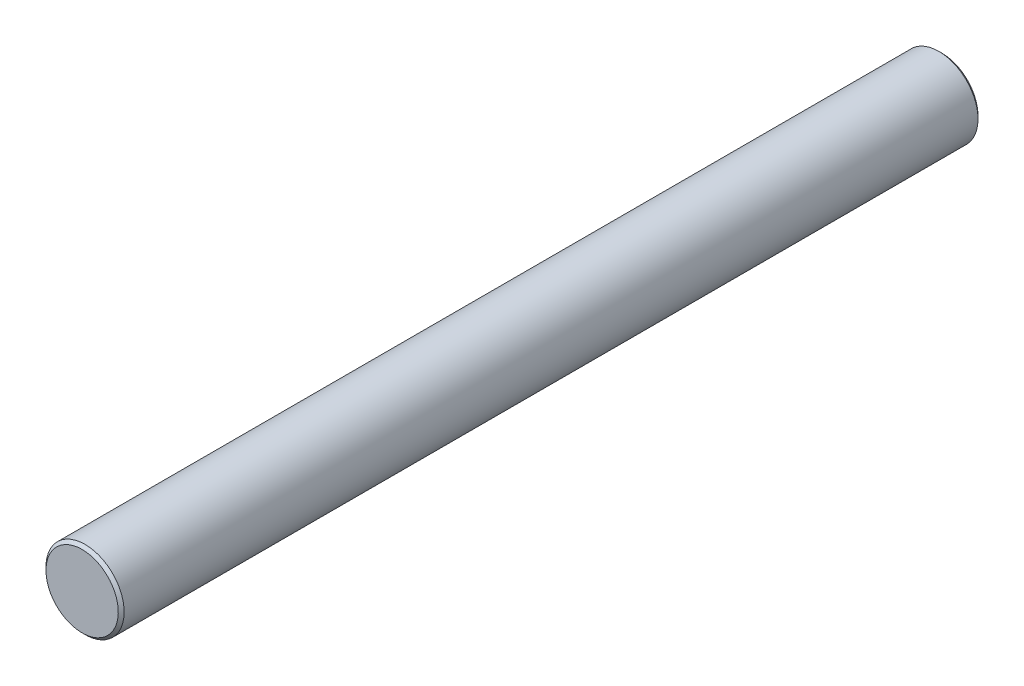
ISO-10303-21;
HEADER;
FILE_DESCRIPTION(('STEP AP214'),'2;1');
FILE_NAME('part.step','',(''),(''),'','','');
FILE_SCHEMA(('AUTOMOTIVE_DESIGN { 1 0 10303 214 1 1 1 1 }'));
ENDSEC;
DATA;
#1=APPLICATION_CONTEXT('core data for automotive mechanical design processes');
#2=APPLICATION_PROTOCOL_DEFINITION('international standard','automotive_design',2000,#1);
#3=PRODUCT_CONTEXT('',#1,'mechanical');
#4=PRODUCT('Part','Part','',(#3));
#5=PRODUCT_RELATED_PRODUCT_CATEGORY('part','',(#4));
#6=PRODUCT_DEFINITION_FORMATION('','',#4);
#7=PRODUCT_DEFINITION_CONTEXT('part definition',#1,'design');
#8=PRODUCT_DEFINITION('design','',#6,#7);
#9=PRODUCT_DEFINITION_SHAPE('','',#8);
#10=(LENGTH_UNIT() NAMED_UNIT(*) SI_UNIT(.MILLI.,.METRE.));
#11=(NAMED_UNIT(*) PLANE_ANGLE_UNIT() SI_UNIT($,.RADIAN.));
#12=(NAMED_UNIT(*) SI_UNIT($,.STERADIAN.) SOLID_ANGLE_UNIT());
#13=UNCERTAINTY_MEASURE_WITH_UNIT(LENGTH_MEASURE(1.E-05),#10,'distance_accuracy_value','');
#14=(GEOMETRIC_REPRESENTATION_CONTEXT(3) GLOBAL_UNCERTAINTY_ASSIGNED_CONTEXT((#13)) GLOBAL_UNIT_ASSIGNED_CONTEXT((#10,
#11,#12)) REPRESENTATION_CONTEXT('',''));
#15=CARTESIAN_POINT('',(0.,0.,0.));
#16=DIRECTION('',(0.,0.,1.));
#17=DIRECTION('',(1.,0.,0.));
#18=AXIS2_PLACEMENT_3D('',#15,#16,#17);
#19=CARTESIAN_POINT('',(0.,9.25,0.));
#20=DIRECTION('',(0.,0.,-1.));
#21=DIRECTION('',(0.,1.,0.));
#22=AXIS2_PLACEMENT_3D('',#19,#20,#21);
#23=PLANE('',#22);
#24=CARTESIAN_POINT('',(0.,0.,0.));
#25=DIRECTION('',(0.,0.,-1.));
#26=DIRECTION('',(0.,1.,0.));
#27=AXIS2_PLACEMENT_3D('',#24,#25,#26);
#28=CIRCLE('',#27,18.5);
#29=CARTESIAN_POINT('',(0.,18.5,0.));
#30=VERTEX_POINT('',#29);
#31=EDGE_CURVE('E9',#30,#30,#28,.T.);
#32=ORIENTED_EDGE('',*,*,#31,.T.);
#33=EDGE_LOOP('',(#32));
#34=FACE_BOUND('',#33,.T.);
#35=CARTESIAN_POINT('',(0.,0.,0.));
#36=DIRECTION('',(0.,0.,1.));
#37=DIRECTION('',(-1.,0.,0.));
#38=AXIS2_PLACEMENT_3D('',#35,#36,#37);
#39=CIRCLE('',#38,6.);
#40=CARTESIAN_POINT('',(-6.,0.,0.));
#41=VERTEX_POINT('',#40);
#42=EDGE_CURVE('E53',#41,#41,#39,.T.);
#43=ORIENTED_EDGE('',*,*,#42,.T.);
#44=EDGE_LOOP('',(#43));
#45=FACE_BOUND('',#44,.T.);
#46=ADVANCED_FACE('F15',(#34,#45),#23,.T.);
#47=CARTESIAN_POINT('',(0.,0.,0.75));
#48=DIRECTION('',(0.,0.,1.));
#49=DIRECTION('',(0.,1.,0.));
#50=AXIS2_PLACEMENT_3D('',#47,#48,#49);
#51=CONICAL_SURFACE('',#50,19.25,0.785398163397448);
#52=CARTESIAN_POINT('',(0.,0.,1.5));
#53=DIRECTION('',(0.,0.,-1.));
#54=DIRECTION('',(0.,1.,0.));
#55=AXIS2_PLACEMENT_3D('',#52,#53,#54);
#56=CIRCLE('',#55,20.);
#57=CARTESIAN_POINT('',(0.,20.,1.5));
#58=VERTEX_POINT('',#57);
#59=EDGE_CURVE('E19',#58,#58,#56,.T.);
#60=ORIENTED_EDGE('',*,*,#59,.T.);
#61=EDGE_LOOP('',(#60));
#62=FACE_BOUND('',#61,.T.);
#63=ORIENTED_EDGE('',*,*,#31,.F.);
#64=EDGE_LOOP('',(#63));
#65=FACE_BOUND('',#64,.T.);
#66=ADVANCED_FACE('F121',(#62,#65),#51,.T.);
#67=CARTESIAN_POINT('',(0.,0.,220.));
#68=DIRECTION('',(0.,0.,1.));
#69=DIRECTION('',(0.,1.,0.));
#70=AXIS2_PLACEMENT_3D('',#67,#68,#69);
#71=CYLINDRICAL_SURFACE('',#70,20.);
#72=CARTESIAN_POINT('',(0.,0.,438.5));
#73=DIRECTION('',(0.,0.,-1.));
#74=DIRECTION('',(0.,1.,0.));
#75=AXIS2_PLACEMENT_3D('',#72,#73,#74);
#76=CIRCLE('',#75,20.);
#77=CARTESIAN_POINT('',(0.,20.,438.5));
#78=VERTEX_POINT('',#77);
#79=EDGE_CURVE('E47',#78,#78,#76,.T.);
#80=ORIENTED_EDGE('',*,*,#79,.T.);
#81=EDGE_LOOP('',(#80));
#82=FACE_BOUND('',#81,.T.);
#83=ORIENTED_EDGE('',*,*,#59,.F.);
#84=EDGE_LOOP('',(#83));
#85=FACE_BOUND('',#84,.T.);
#86=CARTESIAN_POINT('',(0.,0.,6.5));
#87=DIRECTION('',(0.,0.,-1.));
#88=DIRECTION('',(0.,1.,0.));
#89=AXIS2_PLACEMENT_3D('',#86,#87,#88);
#90=CIRCLE('',#89,20.);
#91=CARTESIAN_POINT('',(10.5356537528527,-17.,6.5));
#92=VERTEX_POINT('',#91);
#93=CARTESIAN_POINT('',(-10.5356537528527,-17.,6.5));
#94=VERTEX_POINT('',#93);
#95=EDGE_CURVE('E69',#92,#94,#90,.T.);
#96=ORIENTED_EDGE('',*,*,#95,.T.);
#97=DIRECTION('',(0.,0.,1.));
#98=VECTOR('',#97,1.);
#99=CARTESIAN_POINT('',(-10.5356537528527,-17.,8.25));
#100=LINE('',#99,#98);
#101=CARTESIAN_POINT('',(-10.5356537528527,-17.,10.));
#102=VERTEX_POINT('',#101);
#103=EDGE_CURVE('E62',#94,#102,#100,.T.);
#104=ORIENTED_EDGE('',*,*,#103,.T.);
#105=CARTESIAN_POINT('',(0.,0.,10.));
#106=DIRECTION('',(0.,0.,1.));
#107=DIRECTION('',(0.,1.,0.));
#108=AXIS2_PLACEMENT_3D('',#105,#106,#107);
#109=CIRCLE('',#108,20.);
#110=CARTESIAN_POINT('',(10.5356537528527,-17.,10.));
#111=VERTEX_POINT('',#110);
#112=EDGE_CURVE('E75',#102,#111,#109,.T.);
#113=ORIENTED_EDGE('',*,*,#112,.T.);
#114=DIRECTION('',(0.,0.,-1.));
#115=VECTOR('',#114,1.);
#116=CARTESIAN_POINT('',(10.5356537528527,-17.,8.25));
#117=LINE('',#116,#115);
#118=EDGE_CURVE('E59',#111,#92,#117,.T.);
#119=ORIENTED_EDGE('',*,*,#118,.T.);
#120=EDGE_LOOP('',(#96,#104,#113,#119));
#121=FACE_BOUND('',#120,.T.);
#122=ADVANCED_FACE('F17',(#82,#85,#121),#71,.T.);
#123=CARTESIAN_POINT('',(0.,0.,439.25));
#124=DIRECTION('',(0.,0.,-1.));
#125=DIRECTION('',(0.,1.,0.));
#126=AXIS2_PLACEMENT_3D('',#123,#124,#125);
#127=CONICAL_SURFACE('',#126,19.25,0.785398163397448);
#128=CARTESIAN_POINT('',(0.,0.,440.));
#129=DIRECTION('',(0.,0.,-1.));
#130=DIRECTION('',(0.,1.,0.));
#131=AXIS2_PLACEMENT_3D('',#128,#129,#130);
#132=CIRCLE('',#131,18.5);
#133=CARTESIAN_POINT('',(0.,18.5,440.));
#134=VERTEX_POINT('',#133);
#135=EDGE_CURVE('E43',#134,#134,#132,.T.);
#136=ORIENTED_EDGE('',*,*,#135,.T.);
#137=EDGE_LOOP('',(#136));
#138=FACE_BOUND('',#137,.T.);
#139=ORIENTED_EDGE('',*,*,#79,.F.);
#140=EDGE_LOOP('',(#139));
#141=FACE_BOUND('',#140,.T.);
#142=ADVANCED_FACE('F116',(#138,#141),#127,.T.);
#143=CARTESIAN_POINT('',(0.,9.25,440.));
#144=DIRECTION('',(0.,0.,1.));
#145=DIRECTION('',(0.,-1.,0.));
#146=AXIS2_PLACEMENT_3D('',#143,#144,#145);
#147=PLANE('',#146);
#148=ORIENTED_EDGE('',*,*,#135,.F.);
#149=EDGE_LOOP('',(#148));
#150=FACE_BOUND('',#149,.T.);
#151=ADVANCED_FACE('F110',(#150),#147,.T.);
#152=CARTESIAN_POINT('',(0.,0.,26.4586213285198));
#153=DIRECTION('',(0.,0.,-1.));
#154=DIRECTION('',(-1.,0.,0.));
#155=AXIS2_PLACEMENT_3D('',#152,#153,#154);
#156=CONICAL_SURFACE('',#155,2.52640625,1.0471975511966);
#157=CARTESIAN_POINT('',(0.,0.,25.));
#158=DIRECTION('',(0.,0.,1.));
#159=DIRECTION('',(-1.,0.,0.));
#160=AXIS2_PLACEMENT_3D('',#157,#158,#159);
#161=CIRCLE('',#160,5.0528125);
#162=CARTESIAN_POINT('',(-5.0528125,0.,25.));
#163=VERTEX_POINT('',#162);
#164=EDGE_CURVE('E50',#163,#163,#161,.T.);
#165=ORIENTED_EDGE('',*,*,#164,.F.);
#166=EDGE_LOOP('',(#165));
#167=FACE_BOUND('',#166,.T.);
#168=CARTESIAN_POINT('',(0.,0.,27.9172426570397));
#169=VERTEX_POINT('',#168);
#170=VERTEX_LOOP('',#169);
#171=FACE_BOUND('',#170,.T.);
#172=ADVANCED_FACE('F104',(#167,#171),#156,.F.);
#173=CARTESIAN_POINT('',(0.,0.,12.97359375));
#174=DIRECTION('',(0.,0.,-1.));
#175=DIRECTION('',(-1.,0.,0.));
#176=AXIS2_PLACEMENT_3D('',#173,#174,#175);
#177=CYLINDRICAL_SURFACE('',#176,5.0528125);
#178=CARTESIAN_POINT('',(0.,0.,0.9471875));
#179=DIRECTION('',(0.,0.,1.));
#180=DIRECTION('',(-1.,0.,0.));
#181=AXIS2_PLACEMENT_3D('',#178,#179,#180);
#182=CIRCLE('',#181,5.0528125);
#183=CARTESIAN_POINT('',(-5.0528125,0.,0.9471875));
#184=VERTEX_POINT('',#183);
#185=EDGE_CURVE('E56',#184,#184,#182,.T.);
#186=ORIENTED_EDGE('',*,*,#185,.F.);
#187=EDGE_LOOP('',(#186));
#188=FACE_BOUND('',#187,.T.);
#189=ORIENTED_EDGE('',*,*,#164,.T.);
#190=EDGE_LOOP('',(#189));
#191=FACE_BOUND('',#190,.T.);
#192=ADVANCED_FACE('F101',(#188,#191),#177,.F.);
#193=CARTESIAN_POINT('',(0.,0.,0.47359375));
#194=DIRECTION('',(0.,0.,-1.));
#195=DIRECTION('',(-1.,0.,0.));
#196=AXIS2_PLACEMENT_3D('',#193,#194,#195);
#197=CONICAL_SURFACE('',#196,5.52640625,0.785398163397448);
#198=ORIENTED_EDGE('',*,*,#42,.F.);
#199=EDGE_LOOP('',(#198));
#200=FACE_BOUND('',#199,.T.);
#201=ORIENTED_EDGE('',*,*,#185,.T.);
#202=EDGE_LOOP('',(#201));
#203=FACE_BOUND('',#202,.T.);
#204=ADVANCED_FACE('F99',(#200,#203),#197,.F.);
#205=CARTESIAN_POINT('',(0.,-17.,8.25));
#206=DIRECTION('',(0.,-1.,0.));
#207=DIRECTION('',(0.,0.,-1.));
#208=AXIS2_PLACEMENT_3D('',#205,#206,#207);
#209=PLANE('',#208);
#210=ORIENTED_EDGE('',*,*,#103,.F.);
#211=DIRECTION('',(1.,0.,0.));
#212=VECTOR('',#211,1.);
#213=CARTESIAN_POINT('',(0.,-17.,6.5));
#214=LINE('',#213,#212);
#215=EDGE_CURVE('E66',#94,#92,#214,.T.);
#216=ORIENTED_EDGE('',*,*,#215,.T.);
#217=ORIENTED_EDGE('',*,*,#118,.F.);
#218=DIRECTION('',(-1.,0.,0.));
#219=VECTOR('',#218,1.);
#220=CARTESIAN_POINT('',(0.,-17.,10.));
#221=LINE('',#220,#219);
#222=EDGE_CURVE('E72',#111,#102,#221,.T.);
#223=ORIENTED_EDGE('',*,*,#222,.T.);
#224=EDGE_LOOP('',(#210,#216,#217,#223));
#225=FACE_BOUND('',#224,.T.);
#226=ADVANCED_FACE('F131',(#225),#209,.T.);
#227=CARTESIAN_POINT('',(0.,-19.5,6.5));
#228=DIRECTION('',(0.,0.,1.));
#229=DIRECTION('',(1.,0.,0.));
#230=AXIS2_PLACEMENT_3D('',#227,#228,#229);
#231=PLANE('',#230);
#232=ORIENTED_EDGE('',*,*,#95,.F.);
#233=ORIENTED_EDGE('',*,*,#215,.F.);
#234=EDGE_LOOP('',(#232,#233));
#235=FACE_BOUND('',#234,.T.);
#236=ADVANCED_FACE('F135',(#235),#231,.T.);
#237=CARTESIAN_POINT('',(0.,-19.5,10.));
#238=DIRECTION('',(0.,0.,1.));
#239=DIRECTION('',(1.,0.,0.));
#240=AXIS2_PLACEMENT_3D('',#237,#238,#239);
#241=PLANE('',#240);
#242=ORIENTED_EDGE('',*,*,#112,.F.);
#243=ORIENTED_EDGE('',*,*,#222,.F.);
#244=EDGE_LOOP('',(#242,#243));
#245=FACE_BOUND('',#244,.T.);
#246=ADVANCED_FACE('F87',(#245),#241,.F.);
#247=CLOSED_SHELL('',(#46,#66,#122,#142,#151,#172,#192,#204,#226,#236,#246));
#248=MANIFOLD_SOLID_BREP('B1',#247);
#249=ADVANCED_BREP_SHAPE_REPRESENTATION('',(#18,#248),#14);
#250=SHAPE_DEFINITION_REPRESENTATION(#9,#249);
ENDSEC;
END-ISO-10303-21;
